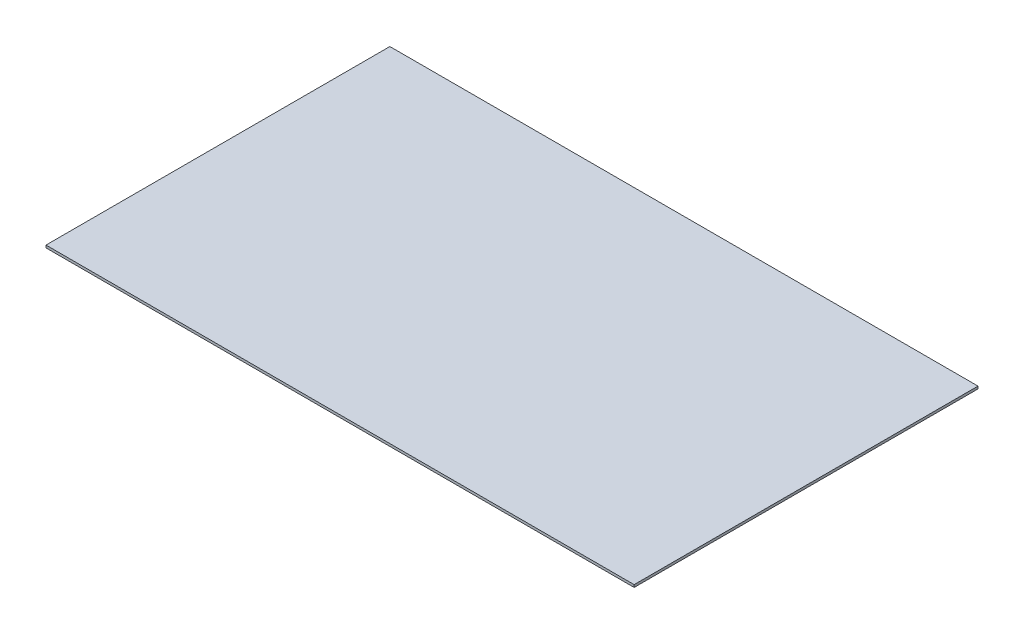
ISO-10303-21;
HEADER;
FILE_DESCRIPTION(('STEP AP214'),'2;1');
FILE_NAME('part.step','',(''),(''),'','','');
FILE_SCHEMA(('AUTOMOTIVE_DESIGN { 1 0 10303 214 1 1 1 1 }'));
ENDSEC;
DATA;
#1=APPLICATION_CONTEXT('core data for automotive mechanical design processes');
#2=APPLICATION_PROTOCOL_DEFINITION('international standard','automotive_design',2000,#1);
#3=PRODUCT_CONTEXT('',#1,'mechanical');
#4=PRODUCT('Part','Part','',(#3));
#5=PRODUCT_RELATED_PRODUCT_CATEGORY('part','',(#4));
#6=PRODUCT_DEFINITION_FORMATION('','',#4);
#7=PRODUCT_DEFINITION_CONTEXT('part definition',#1,'design');
#8=PRODUCT_DEFINITION('design','',#6,#7);
#9=PRODUCT_DEFINITION_SHAPE('','',#8);
#10=(LENGTH_UNIT() NAMED_UNIT(*) SI_UNIT(.MILLI.,.METRE.));
#11=(NAMED_UNIT(*) PLANE_ANGLE_UNIT() SI_UNIT($,.RADIAN.));
#12=(NAMED_UNIT(*) SI_UNIT($,.STERADIAN.) SOLID_ANGLE_UNIT());
#13=UNCERTAINTY_MEASURE_WITH_UNIT(LENGTH_MEASURE(1.E-05),#10,'distance_accuracy_value','');
#14=(GEOMETRIC_REPRESENTATION_CONTEXT(3) GLOBAL_UNCERTAINTY_ASSIGNED_CONTEXT((#13)) GLOBAL_UNIT_ASSIGNED_CONTEXT((#10,
#11,#12)) REPRESENTATION_CONTEXT('',''));
#15=CARTESIAN_POINT('',(0.,0.,0.));
#16=DIRECTION('',(0.,0.,1.));
#17=DIRECTION('',(1.,0.,0.));
#18=AXIS2_PLACEMENT_3D('',#15,#16,#17);
#19=CARTESIAN_POINT('',(-1069.,9.,625.));
#20=DIRECTION('',(1.,0.,0.));
#21=DIRECTION('',(0.,0.,-1.));
#22=AXIS2_PLACEMENT_3D('',#19,#20,#21);
#23=PLANE('',#22);
#24=DIRECTION('',(0.,0.,1.));
#25=VECTOR('',#24,1.);
#26=CARTESIAN_POINT('',(-1069.,0.,625.));
#27=LINE('',#26,#25);
#28=CARTESIAN_POINT('',(-1069.,0.,-625.));
#29=VERTEX_POINT('',#28);
#30=CARTESIAN_POINT('',(-1069.,0.,625.));
#31=VERTEX_POINT('',#30);
#32=EDGE_CURVE('E98',#29,#31,#27,.T.);
#33=ORIENTED_EDGE('',*,*,#32,.T.);
#34=DIRECTION('',(0.,-1.,0.));
#35=VECTOR('',#34,1.);
#36=CARTESIAN_POINT('',(-1069.,9.,625.));
#37=LINE('',#36,#35);
#38=CARTESIAN_POINT('',(-1069.,9.,625.));
#39=VERTEX_POINT('',#38);
#40=EDGE_CURVE('E11',#39,#31,#37,.T.);
#41=ORIENTED_EDGE('',*,*,#40,.F.);
#42=DIRECTION('',(0.,0.,1.));
#43=VECTOR('',#42,1.);
#44=CARTESIAN_POINT('',(-1069.,9.,625.));
#45=LINE('',#44,#43);
#46=CARTESIAN_POINT('',(-1069.,9.,-625.));
#47=VERTEX_POINT('',#46);
#48=EDGE_CURVE('E86',#47,#39,#45,.T.);
#49=ORIENTED_EDGE('',*,*,#48,.F.);
#50=DIRECTION('',(0.,-1.,0.));
#51=VECTOR('',#50,1.);
#52=CARTESIAN_POINT('',(-1069.,9.,-625.));
#53=LINE('',#52,#51);
#54=EDGE_CURVE('E94',#47,#29,#53,.T.);
#55=ORIENTED_EDGE('',*,*,#54,.T.);
#56=EDGE_LOOP('',(#33,#41,#49,#55));
#57=FACE_BOUND('',#56,.T.);
#58=ADVANCED_FACE('F35',(#57),#23,.F.);
#59=CARTESIAN_POINT('',(1069.,9.,625.));
#60=DIRECTION('',(0.,0.,-1.));
#61=DIRECTION('',(-1.,0.,0.));
#62=AXIS2_PLACEMENT_3D('',#59,#60,#61);
#63=PLANE('',#62);
#64=DIRECTION('',(1.,0.,0.));
#65=VECTOR('',#64,1.);
#66=CARTESIAN_POINT('',(1069.,0.,625.));
#67=LINE('',#66,#65);
#68=CARTESIAN_POINT('',(1069.,0.,625.));
#69=VERTEX_POINT('',#68);
#70=EDGE_CURVE('E90',#31,#69,#67,.T.);
#71=ORIENTED_EDGE('',*,*,#70,.T.);
#72=DIRECTION('',(0.,-1.,0.));
#73=VECTOR('',#72,1.);
#74=CARTESIAN_POINT('',(1069.,9.,625.));
#75=LINE('',#74,#73);
#76=CARTESIAN_POINT('',(1069.,9.,625.));
#77=VERTEX_POINT('',#76);
#78=EDGE_CURVE('E43',#77,#69,#75,.T.);
#79=ORIENTED_EDGE('',*,*,#78,.F.);
#80=DIRECTION('',(1.,0.,0.));
#81=VECTOR('',#80,1.);
#82=CARTESIAN_POINT('',(1069.,9.,625.));
#83=LINE('',#82,#81);
#84=EDGE_CURVE('E81',#39,#77,#83,.T.);
#85=ORIENTED_EDGE('',*,*,#84,.F.);
#86=ORIENTED_EDGE('',*,*,#40,.T.);
#87=EDGE_LOOP('',(#71,#79,#85,#86));
#88=FACE_BOUND('',#87,.T.);
#89=ADVANCED_FACE('F89',(#88),#63,.F.);
#90=CARTESIAN_POINT('',(1069.,9.,625.));
#91=DIRECTION('',(-1.,0.,0.));
#92=DIRECTION('',(0.,0.,1.));
#93=AXIS2_PLACEMENT_3D('',#90,#91,#92);
#94=PLANE('',#93);
#95=DIRECTION('',(0.,0.,-1.));
#96=VECTOR('',#95,1.);
#97=CARTESIAN_POINT('',(1069.,0.,625.));
#98=LINE('',#97,#96);
#99=CARTESIAN_POINT('',(1069.,0.,-625.));
#100=VERTEX_POINT('',#99);
#101=EDGE_CURVE('E68',#69,#100,#98,.T.);
#102=ORIENTED_EDGE('',*,*,#101,.T.);
#103=DIRECTION('',(0.,-1.,0.));
#104=VECTOR('',#103,1.);
#105=CARTESIAN_POINT('',(1069.,9.,-625.));
#106=LINE('',#105,#104);
#107=CARTESIAN_POINT('',(1069.,9.,-625.));
#108=VERTEX_POINT('',#107);
#109=EDGE_CURVE('E91',#108,#100,#106,.T.);
#110=ORIENTED_EDGE('',*,*,#109,.F.);
#111=DIRECTION('',(0.,0.,-1.));
#112=VECTOR('',#111,1.);
#113=CARTESIAN_POINT('',(1069.,9.,625.));
#114=LINE('',#113,#112);
#115=EDGE_CURVE('E84',#77,#108,#114,.T.);
#116=ORIENTED_EDGE('',*,*,#115,.F.);
#117=ORIENTED_EDGE('',*,*,#78,.T.);
#118=EDGE_LOOP('',(#102,#110,#116,#117));
#119=FACE_BOUND('',#118,.T.);
#120=ADVANCED_FACE('F92',(#119),#94,.F.);
#121=CARTESIAN_POINT('',(1069.,9.,-625.));
#122=DIRECTION('',(0.,0.,1.));
#123=DIRECTION('',(1.,0.,0.));
#124=AXIS2_PLACEMENT_3D('',#121,#122,#123);
#125=PLANE('',#124);
#126=DIRECTION('',(-1.,0.,0.));
#127=VECTOR('',#126,1.);
#128=CARTESIAN_POINT('',(1069.,0.,-625.));
#129=LINE('',#128,#127);
#130=EDGE_CURVE('E74',#100,#29,#129,.T.);
#131=ORIENTED_EDGE('',*,*,#130,.T.);
#132=ORIENTED_EDGE('',*,*,#54,.F.);
#133=DIRECTION('',(-1.,0.,0.));
#134=VECTOR('',#133,1.);
#135=CARTESIAN_POINT('',(1069.,9.,-625.));
#136=LINE('',#135,#134);
#137=EDGE_CURVE('E51',#108,#47,#136,.T.);
#138=ORIENTED_EDGE('',*,*,#137,.F.);
#139=ORIENTED_EDGE('',*,*,#109,.T.);
#140=EDGE_LOOP('',(#131,#132,#138,#139));
#141=FACE_BOUND('',#140,.T.);
#142=ADVANCED_FACE('F105',(#141),#125,.F.);
#143=CARTESIAN_POINT('',(0.,9.,0.));
#144=DIRECTION('',(0.,1.,0.));
#145=DIRECTION('',(0.,0.,1.));
#146=AXIS2_PLACEMENT_3D('',#143,#144,#145);
#147=PLANE('',#146);
#148=ORIENTED_EDGE('',*,*,#48,.T.);
#149=ORIENTED_EDGE('',*,*,#84,.T.);
#150=ORIENTED_EDGE('',*,*,#115,.T.);
#151=ORIENTED_EDGE('',*,*,#137,.T.);
#152=EDGE_LOOP('',(#148,#149,#150,#151));
#153=FACE_BOUND('',#152,.T.);
#154=ADVANCED_FACE('F82',(#153),#147,.T.);
#155=CARTESIAN_POINT('',(0.,0.,0.));
#156=DIRECTION('',(0.,1.,0.));
#157=DIRECTION('',(0.,0.,1.));
#158=AXIS2_PLACEMENT_3D('',#155,#156,#157);
#159=PLANE('',#158);
#160=ORIENTED_EDGE('',*,*,#32,.F.);
#161=ORIENTED_EDGE('',*,*,#130,.F.);
#162=ORIENTED_EDGE('',*,*,#101,.F.);
#163=ORIENTED_EDGE('',*,*,#70,.F.);
#164=EDGE_LOOP('',(#160,#161,#162,#163));
#165=FACE_BOUND('',#164,.T.);
#166=ADVANCED_FACE('F108',(#165),#159,.F.);
#167=CLOSED_SHELL('',(#58,#89,#120,#142,#154,#166));
#168=MANIFOLD_SOLID_BREP('B2',#167);
#169=ADVANCED_BREP_SHAPE_REPRESENTATION('',(#18,#168),#14);
#170=SHAPE_DEFINITION_REPRESENTATION(#9,#169);
ENDSEC;
END-ISO-10303-21;
